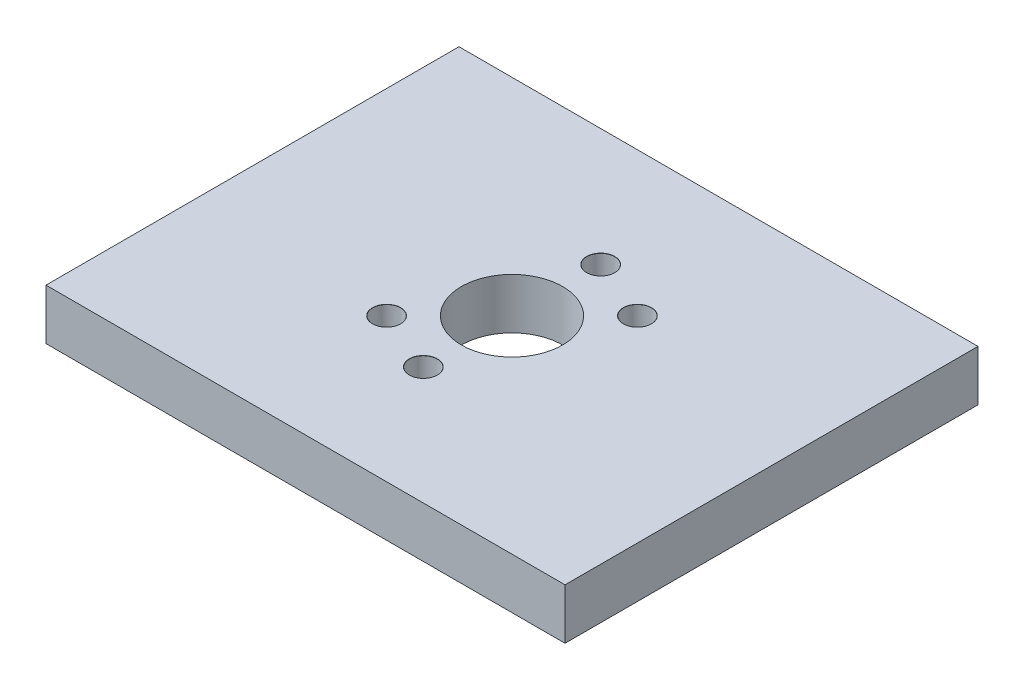
ISO-10303-21;
HEADER;
FILE_DESCRIPTION(('STEP AP214'),'2;1');
FILE_NAME('part.step','',(''),(''),'','','');
FILE_SCHEMA(('AUTOMOTIVE_DESIGN { 1 0 10303 214 1 1 1 1 }'));
ENDSEC;
DATA;
#1=APPLICATION_CONTEXT('core data for automotive mechanical design processes');
#2=APPLICATION_PROTOCOL_DEFINITION('international standard','automotive_design',2000,#1);
#3=PRODUCT_CONTEXT('',#1,'mechanical');
#4=PRODUCT('Part','Part','',(#3));
#5=PRODUCT_RELATED_PRODUCT_CATEGORY('part','',(#4));
#6=PRODUCT_DEFINITION_FORMATION('','',#4);
#7=PRODUCT_DEFINITION_CONTEXT('part definition',#1,'design');
#8=PRODUCT_DEFINITION('design','',#6,#7);
#9=PRODUCT_DEFINITION_SHAPE('','',#8);
#10=(LENGTH_UNIT() NAMED_UNIT(*) SI_UNIT(.MILLI.,.METRE.));
#11=(NAMED_UNIT(*) PLANE_ANGLE_UNIT() SI_UNIT($,.RADIAN.));
#12=(NAMED_UNIT(*) SI_UNIT($,.STERADIAN.) SOLID_ANGLE_UNIT());
#13=UNCERTAINTY_MEASURE_WITH_UNIT(LENGTH_MEASURE(1.E-05),#10,'distance_accuracy_value','');
#14=(GEOMETRIC_REPRESENTATION_CONTEXT(3) GLOBAL_UNCERTAINTY_ASSIGNED_CONTEXT((#13)) GLOBAL_UNIT_ASSIGNED_CONTEXT((#10,
#11,#12)) REPRESENTATION_CONTEXT('',''));
#15=CARTESIAN_POINT('',(0.,0.,0.));
#16=DIRECTION('',(0.,0.,1.));
#17=DIRECTION('',(1.,0.,0.));
#18=AXIS2_PLACEMENT_3D('',#15,#16,#17);
#19=CARTESIAN_POINT('',(51.2218795930272,10.,40.7541930276946));
#20=DIRECTION('',(-1.,0.,0.));
#21=DIRECTION('',(0.,0.,1.));
#22=AXIS2_PLACEMENT_3D('',#19,#20,#21);
#23=PLANE('',#22);
#24=DIRECTION('',(0.,0.,-1.));
#25=VECTOR('',#24,1.);
#26=CARTESIAN_POINT('',(51.2218795930272,0.,40.7541930276946));
#27=LINE('',#26,#25);
#28=CARTESIAN_POINT('',(51.2218795930272,0.,40.7541930276946));
#29=VERTEX_POINT('',#28);
#30=CARTESIAN_POINT('',(51.2218795930272,0.,-40.7541930276946));
#31=VERTEX_POINT('',#30);
#32=EDGE_CURVE('E99',#29,#31,#27,.T.);
#33=ORIENTED_EDGE('',*,*,#32,.T.);
#34=DIRECTION('',(0.,-1.,0.));
#35=VECTOR('',#34,1.);
#36=CARTESIAN_POINT('',(51.2218795930272,10.,-40.7541930276946));
#37=LINE('',#36,#35);
#38=CARTESIAN_POINT('',(51.2218795930272,10.,-40.7541930276946));
#39=VERTEX_POINT('',#38);
#40=EDGE_CURVE('E11',#39,#31,#37,.T.);
#41=ORIENTED_EDGE('',*,*,#40,.F.);
#42=DIRECTION('',(0.,0.,-1.));
#43=VECTOR('',#42,1.);
#44=CARTESIAN_POINT('',(51.2218795930272,10.,40.7541930276946));
#45=LINE('',#44,#43);
#46=CARTESIAN_POINT('',(51.2218795930272,10.,40.7541930276946));
#47=VERTEX_POINT('',#46);
#48=EDGE_CURVE('E87',#47,#39,#45,.T.);
#49=ORIENTED_EDGE('',*,*,#48,.F.);
#50=DIRECTION('',(0.,-1.,0.));
#51=VECTOR('',#50,1.);
#52=CARTESIAN_POINT('',(51.2218795930272,10.,40.7541930276946));
#53=LINE('',#52,#51);
#54=EDGE_CURVE('E95',#47,#29,#53,.T.);
#55=ORIENTED_EDGE('',*,*,#54,.T.);
#56=EDGE_LOOP('',(#33,#41,#49,#55));
#57=FACE_BOUND('',#56,.T.);
#58=ADVANCED_FACE('F36',(#57),#23,.F.);
#59=CARTESIAN_POINT('',(-51.2218795930272,10.,-40.7541930276946));
#60=DIRECTION('',(0.,0.,1.));
#61=DIRECTION('',(1.,0.,0.));
#62=AXIS2_PLACEMENT_3D('',#59,#60,#61);
#63=PLANE('',#62);
#64=DIRECTION('',(-1.,0.,0.));
#65=VECTOR('',#64,1.);
#66=CARTESIAN_POINT('',(-51.2218795930272,0.,-40.7541930276946));
#67=LINE('',#66,#65);
#68=CARTESIAN_POINT('',(-51.2218795930272,0.,-40.7541930276946));
#69=VERTEX_POINT('',#68);
#70=EDGE_CURVE('E91',#31,#69,#67,.T.);
#71=ORIENTED_EDGE('',*,*,#70,.T.);
#72=DIRECTION('',(0.,-1.,0.));
#73=VECTOR('',#72,1.);
#74=CARTESIAN_POINT('',(-51.2218795930272,10.,-40.7541930276946));
#75=LINE('',#74,#73);
#76=CARTESIAN_POINT('',(-51.2218795930272,10.,-40.7541930276946));
#77=VERTEX_POINT('',#76);
#78=EDGE_CURVE('E44',#77,#69,#75,.T.);
#79=ORIENTED_EDGE('',*,*,#78,.F.);
#80=DIRECTION('',(-1.,0.,0.));
#81=VECTOR('',#80,1.);
#82=CARTESIAN_POINT('',(-51.2218795930272,10.,-40.7541930276946));
#83=LINE('',#82,#81);
#84=EDGE_CURVE('E82',#39,#77,#83,.T.);
#85=ORIENTED_EDGE('',*,*,#84,.F.);
#86=ORIENTED_EDGE('',*,*,#40,.T.);
#87=EDGE_LOOP('',(#71,#79,#85,#86));
#88=FACE_BOUND('',#87,.T.);
#89=ADVANCED_FACE('F90',(#88),#63,.F.);
#90=CARTESIAN_POINT('',(-51.2218795930272,10.,40.7541930276946));
#91=DIRECTION('',(1.,0.,0.));
#92=DIRECTION('',(0.,0.,-1.));
#93=AXIS2_PLACEMENT_3D('',#90,#91,#92);
#94=PLANE('',#93);
#95=DIRECTION('',(0.,0.,1.));
#96=VECTOR('',#95,1.);
#97=CARTESIAN_POINT('',(-51.2218795930272,0.,40.7541930276946));
#98=LINE('',#97,#96);
#99=CARTESIAN_POINT('',(-51.2218795930272,0.,40.7541930276946));
#100=VERTEX_POINT('',#99);
#101=EDGE_CURVE('E69',#69,#100,#98,.T.);
#102=ORIENTED_EDGE('',*,*,#101,.T.);
#103=DIRECTION('',(0.,-1.,0.));
#104=VECTOR('',#103,1.);
#105=CARTESIAN_POINT('',(-51.2218795930272,10.,40.7541930276946));
#106=LINE('',#105,#104);
#107=CARTESIAN_POINT('',(-51.2218795930272,10.,40.7541930276946));
#108=VERTEX_POINT('',#107);
#109=EDGE_CURVE('E92',#108,#100,#106,.T.);
#110=ORIENTED_EDGE('',*,*,#109,.F.);
#111=DIRECTION('',(0.,0.,1.));
#112=VECTOR('',#111,1.);
#113=CARTESIAN_POINT('',(-51.2218795930272,10.,40.7541930276946));
#114=LINE('',#113,#112);
#115=EDGE_CURVE('E85',#77,#108,#114,.T.);
#116=ORIENTED_EDGE('',*,*,#115,.F.);
#117=ORIENTED_EDGE('',*,*,#78,.T.);
#118=EDGE_LOOP('',(#102,#110,#116,#117));
#119=FACE_BOUND('',#118,.T.);
#120=ADVANCED_FACE('F93',(#119),#94,.F.);
#121=CARTESIAN_POINT('',(-51.2218795930272,10.,40.7541930276946));
#122=DIRECTION('',(0.,0.,-1.));
#123=DIRECTION('',(-1.,0.,0.));
#124=AXIS2_PLACEMENT_3D('',#121,#122,#123);
#125=PLANE('',#124);
#126=DIRECTION('',(1.,0.,0.));
#127=VECTOR('',#126,1.);
#128=CARTESIAN_POINT('',(-51.2218795930272,0.,40.7541930276946));
#129=LINE('',#128,#127);
#130=EDGE_CURVE('E75',#100,#29,#129,.T.);
#131=ORIENTED_EDGE('',*,*,#130,.T.);
#132=ORIENTED_EDGE('',*,*,#54,.F.);
#133=DIRECTION('',(1.,0.,0.));
#134=VECTOR('',#133,1.);
#135=CARTESIAN_POINT('',(-51.2218795930272,10.,40.7541930276946));
#136=LINE('',#135,#134);
#137=EDGE_CURVE('E52',#108,#47,#136,.T.);
#138=ORIENTED_EDGE('',*,*,#137,.F.);
#139=ORIENTED_EDGE('',*,*,#109,.T.);
#140=EDGE_LOOP('',(#131,#132,#138,#139));
#141=FACE_BOUND('',#140,.T.);
#142=ADVANCED_FACE('F107',(#141),#125,.F.);
#143=CARTESIAN_POINT('',(0.,10.,0.));
#144=DIRECTION('',(0.,-1.,0.));
#145=DIRECTION('',(0.,0.,-1.));
#146=AXIS2_PLACEMENT_3D('',#143,#144,#145);
#147=PLANE('',#146);
#148=CARTESIAN_POINT('',(0.,10.,0.));
#149=DIRECTION('',(0.,1.,0.));
#150=DIRECTION('',(0.,0.,1.));
#151=AXIS2_PLACEMENT_3D('',#148,#149,#150);
#152=CIRCLE('',#151,10.);
#153=CARTESIAN_POINT('',(0.,10.,10.));
#154=VERTEX_POINT('',#153);
#155=EDGE_CURVE('E149',#154,#154,#152,.T.);
#156=ORIENTED_EDGE('',*,*,#155,.F.);
#157=EDGE_LOOP('',(#156));
#158=FACE_BOUND('',#157,.T.);
#159=CARTESIAN_POINT('',(-12.3743686707647,10.,12.3743686707645));
#160=DIRECTION('',(0.,1.,0.));
#161=DIRECTION('',(0.,0.,1.));
#162=AXIS2_PLACEMENT_3D('',#159,#160,#161);
#163=CIRCLE('',#162,2.775);
#164=CARTESIAN_POINT('',(-12.3743686707647,10.,15.1493686707645));
#165=VERTEX_POINT('',#164);
#166=EDGE_CURVE('E145',#165,#165,#163,.T.);
#167=ORIENTED_EDGE('',*,*,#166,.F.);
#168=EDGE_LOOP('',(#167));
#169=FACE_BOUND('',#168,.T.);
#170=CARTESIAN_POINT('',(-1.196959198424E-13,10.,17.5));
#171=DIRECTION('',(0.,1.,0.));
#172=DIRECTION('',(0.,0.,1.));
#173=AXIS2_PLACEMENT_3D('',#170,#171,#172);
#174=CIRCLE('',#173,2.775);
#175=CARTESIAN_POINT('',(-1.196959198424E-13,10.,20.275));
#176=VERTEX_POINT('',#175);
#177=EDGE_CURVE('E136',#176,#176,#174,.T.);
#178=ORIENTED_EDGE('',*,*,#177,.F.);
#179=EDGE_LOOP('',(#178));
#180=FACE_BOUND('',#179,.T.);
#181=CARTESIAN_POINT('',(12.3743686707648,10.,-12.3743686707644));
#182=DIRECTION('',(0.,1.,0.));
#183=DIRECTION('',(0.,0.,1.));
#184=AXIS2_PLACEMENT_3D('',#181,#182,#183);
#185=CIRCLE('',#184,2.775);
#186=CARTESIAN_POINT('',(12.3743686707648,10.,-9.59936867076439));
#187=VERTEX_POINT('',#186);
#188=EDGE_CURVE('E127',#187,#187,#185,.T.);
#189=ORIENTED_EDGE('',*,*,#188,.F.);
#190=EDGE_LOOP('',(#189));
#191=FACE_BOUND('',#190,.T.);
#192=CARTESIAN_POINT('',(0.,10.,-17.5));
#193=DIRECTION('',(0.,1.,0.));
#194=DIRECTION('',(0.,0.,1.));
#195=AXIS2_PLACEMENT_3D('',#192,#193,#194);
#196=CIRCLE('',#195,2.775);
#197=CARTESIAN_POINT('',(0.,10.,-14.725));
#198=VERTEX_POINT('',#197);
#199=EDGE_CURVE('E118',#198,#198,#196,.T.);
#200=ORIENTED_EDGE('',*,*,#199,.F.);
#201=EDGE_LOOP('',(#200));
#202=FACE_BOUND('',#201,.T.);
#203=ORIENTED_EDGE('',*,*,#48,.T.);
#204=ORIENTED_EDGE('',*,*,#84,.T.);
#205=ORIENTED_EDGE('',*,*,#115,.T.);
#206=ORIENTED_EDGE('',*,*,#137,.T.);
#207=EDGE_LOOP('',(#203,#204,#205,#206));
#208=FACE_BOUND('',#207,.T.);
#209=ADVANCED_FACE('F83',(#158,#169,#180,#191,#202,#208),#147,.F.);
#210=CARTESIAN_POINT('',(0.,0.,0.));
#211=DIRECTION('',(0.,-1.,0.));
#212=DIRECTION('',(0.,0.,-1.));
#213=AXIS2_PLACEMENT_3D('',#210,#211,#212);
#214=PLANE('',#213);
#215=CARTESIAN_POINT('',(0.,0.,0.));
#216=DIRECTION('',(0.,1.,0.));
#217=DIRECTION('',(0.,0.,1.));
#218=AXIS2_PLACEMENT_3D('',#215,#216,#217);
#219=CIRCLE('',#218,10.);
#220=CARTESIAN_POINT('',(0.,0.,10.));
#221=VERTEX_POINT('',#220);
#222=EDGE_CURVE('E148',#221,#221,#219,.T.);
#223=ORIENTED_EDGE('',*,*,#222,.T.);
#224=EDGE_LOOP('',(#223));
#225=FACE_BOUND('',#224,.T.);
#226=CARTESIAN_POINT('',(-12.3743686707647,0.,12.3743686707645));
#227=DIRECTION('',(0.,1.,0.));
#228=DIRECTION('',(0.,0.,1.));
#229=AXIS2_PLACEMENT_3D('',#226,#227,#228);
#230=CIRCLE('',#229,2.75);
#231=CARTESIAN_POINT('',(-12.3743686707647,0.,15.1243686707645));
#232=VERTEX_POINT('',#231);
#233=EDGE_CURVE('E139',#232,#232,#230,.T.);
#234=ORIENTED_EDGE('',*,*,#233,.T.);
#235=EDGE_LOOP('',(#234));
#236=FACE_BOUND('',#235,.T.);
#237=CARTESIAN_POINT('',(-1.196959198424E-13,0.,17.5));
#238=DIRECTION('',(0.,1.,0.));
#239=DIRECTION('',(0.,0.,1.));
#240=AXIS2_PLACEMENT_3D('',#237,#238,#239);
#241=CIRCLE('',#240,2.75);
#242=CARTESIAN_POINT('',(-1.196959198424E-13,0.,20.25));
#243=VERTEX_POINT('',#242);
#244=EDGE_CURVE('E130',#243,#243,#241,.T.);
#245=ORIENTED_EDGE('',*,*,#244,.T.);
#246=EDGE_LOOP('',(#245));
#247=FACE_BOUND('',#246,.T.);
#248=CARTESIAN_POINT('',(12.3743686707648,0.,-12.3743686707644));
#249=DIRECTION('',(0.,1.,0.));
#250=DIRECTION('',(0.,0.,1.));
#251=AXIS2_PLACEMENT_3D('',#248,#249,#250);
#252=CIRCLE('',#251,2.75);
#253=CARTESIAN_POINT('',(12.3743686707648,0.,-9.6243686707644));
#254=VERTEX_POINT('',#253);
#255=EDGE_CURVE('E121',#254,#254,#252,.T.);
#256=ORIENTED_EDGE('',*,*,#255,.T.);
#257=EDGE_LOOP('',(#256));
#258=FACE_BOUND('',#257,.T.);
#259=CARTESIAN_POINT('',(0.,0.,-17.5));
#260=DIRECTION('',(0.,1.,0.));
#261=DIRECTION('',(0.,0.,1.));
#262=AXIS2_PLACEMENT_3D('',#259,#260,#261);
#263=CIRCLE('',#262,2.75);
#264=CARTESIAN_POINT('',(0.,0.,-14.75));
#265=VERTEX_POINT('',#264);
#266=EDGE_CURVE('E102',#265,#265,#263,.T.);
#267=ORIENTED_EDGE('',*,*,#266,.T.);
#268=EDGE_LOOP('',(#267));
#269=FACE_BOUND('',#268,.T.);
#270=ORIENTED_EDGE('',*,*,#32,.F.);
#271=ORIENTED_EDGE('',*,*,#130,.F.);
#272=ORIENTED_EDGE('',*,*,#101,.F.);
#273=ORIENTED_EDGE('',*,*,#70,.F.);
#274=EDGE_LOOP('',(#270,#271,#272,#273));
#275=FACE_BOUND('',#274,.T.);
#276=ADVANCED_FACE('F110',(#225,#236,#247,#258,#269,#275),#214,.T.);
#277=CARTESIAN_POINT('',(0.,10.,-17.5));
#278=DIRECTION('',(0.,1.,0.));
#279=DIRECTION('',(0.,0.,1.));
#280=AXIS2_PLACEMENT_3D('',#277,#278,#279);
#281=CYLINDRICAL_SURFACE('',#280,2.75);
#282=ORIENTED_EDGE('',*,*,#266,.F.);
#283=EDGE_LOOP('',(#282));
#284=FACE_BOUND('',#283,.T.);
#285=CARTESIAN_POINT('',(0.,9.975,-17.5));
#286=DIRECTION('',(0.,1.,0.));
#287=DIRECTION('',(0.,0.,1.));
#288=AXIS2_PLACEMENT_3D('',#285,#286,#287);
#289=CIRCLE('',#288,2.75);
#290=CARTESIAN_POINT('',(0.,9.975,-14.75));
#291=VERTEX_POINT('',#290);
#292=EDGE_CURVE('E115',#291,#291,#289,.T.);
#293=ORIENTED_EDGE('',*,*,#292,.T.);
#294=EDGE_LOOP('',(#293));
#295=FACE_BOUND('',#294,.T.);
#296=ADVANCED_FACE('F178',(#284,#295),#281,.F.);
#297=CARTESIAN_POINT('',(0.,10.,-17.5));
#298=DIRECTION('',(0.,1.,0.));
#299=DIRECTION('',(0.,0.,1.));
#300=AXIS2_PLACEMENT_3D('',#297,#298,#299);
#301=CONICAL_SURFACE('',#300,2.775,0.785398163397414);
#302=ORIENTED_EDGE('',*,*,#292,.F.);
#303=EDGE_LOOP('',(#302));
#304=FACE_BOUND('',#303,.T.);
#305=ORIENTED_EDGE('',*,*,#199,.T.);
#306=EDGE_LOOP('',(#305));
#307=FACE_BOUND('',#306,.T.);
#308=ADVANCED_FACE('F175',(#304,#307),#301,.F.);
#309=CARTESIAN_POINT('',(12.3743686707648,10.,-12.3743686707644));
#310=DIRECTION('',(0.,1.,0.));
#311=DIRECTION('',(0.,0.,1.));
#312=AXIS2_PLACEMENT_3D('',#309,#310,#311);
#313=CYLINDRICAL_SURFACE('',#312,2.75);
#314=ORIENTED_EDGE('',*,*,#255,.F.);
#315=EDGE_LOOP('',(#314));
#316=FACE_BOUND('',#315,.T.);
#317=CARTESIAN_POINT('',(12.3743686707648,9.975,-12.3743686707644));
#318=DIRECTION('',(0.,1.,0.));
#319=DIRECTION('',(0.,0.,1.));
#320=AXIS2_PLACEMENT_3D('',#317,#318,#319);
#321=CIRCLE('',#320,2.75);
#322=CARTESIAN_POINT('',(12.3743686707648,9.975,-9.62436867076439));
#323=VERTEX_POINT('',#322);
#324=EDGE_CURVE('E124',#323,#323,#321,.T.);
#325=ORIENTED_EDGE('',*,*,#324,.T.);
#326=EDGE_LOOP('',(#325));
#327=FACE_BOUND('',#326,.T.);
#328=ADVANCED_FACE('F177',(#316,#327),#313,.F.);
#329=CARTESIAN_POINT('',(12.3743686707648,10.,-12.3743686707644));
#330=DIRECTION('',(0.,1.,0.));
#331=DIRECTION('',(0.,0.,1.));
#332=AXIS2_PLACEMENT_3D('',#329,#330,#331);
#333=CONICAL_SURFACE('',#332,2.775,0.785398163397414);
#334=ORIENTED_EDGE('',*,*,#324,.F.);
#335=EDGE_LOOP('',(#334));
#336=FACE_BOUND('',#335,.T.);
#337=ORIENTED_EDGE('',*,*,#188,.T.);
#338=EDGE_LOOP('',(#337));
#339=FACE_BOUND('',#338,.T.);
#340=ADVANCED_FACE('F185',(#336,#339),#333,.F.);
#341=CARTESIAN_POINT('',(-1.196959198424E-13,10.,17.5));
#342=DIRECTION('',(0.,1.,0.));
#343=DIRECTION('',(0.,0.,1.));
#344=AXIS2_PLACEMENT_3D('',#341,#342,#343);
#345=CYLINDRICAL_SURFACE('',#344,2.75);
#346=ORIENTED_EDGE('',*,*,#244,.F.);
#347=EDGE_LOOP('',(#346));
#348=FACE_BOUND('',#347,.T.);
#349=CARTESIAN_POINT('',(-1.196959198424E-13,9.975,17.5));
#350=DIRECTION('',(0.,1.,0.));
#351=DIRECTION('',(0.,0.,1.));
#352=AXIS2_PLACEMENT_3D('',#349,#350,#351);
#353=CIRCLE('',#352,2.75);
#354=CARTESIAN_POINT('',(-1.196959198424E-13,9.975,20.25));
#355=VERTEX_POINT('',#354);
#356=EDGE_CURVE('E133',#355,#355,#353,.T.);
#357=ORIENTED_EDGE('',*,*,#356,.T.);
#358=EDGE_LOOP('',(#357));
#359=FACE_BOUND('',#358,.T.);
#360=ADVANCED_FACE('F235',(#348,#359),#345,.F.);
#361=CARTESIAN_POINT('',(-1.196959198424E-13,10.,17.5));
#362=DIRECTION('',(0.,1.,0.));
#363=DIRECTION('',(0.,0.,1.));
#364=AXIS2_PLACEMENT_3D('',#361,#362,#363);
#365=CONICAL_SURFACE('',#364,2.775,0.785398163397414);
#366=ORIENTED_EDGE('',*,*,#356,.F.);
#367=EDGE_LOOP('',(#366));
#368=FACE_BOUND('',#367,.T.);
#369=ORIENTED_EDGE('',*,*,#177,.T.);
#370=EDGE_LOOP('',(#369));
#371=FACE_BOUND('',#370,.T.);
#372=ADVANCED_FACE('F245',(#368,#371),#365,.F.);
#373=CARTESIAN_POINT('',(-12.3743686707647,10.,12.3743686707645));
#374=DIRECTION('',(0.,1.,0.));
#375=DIRECTION('',(0.,0.,1.));
#376=AXIS2_PLACEMENT_3D('',#373,#374,#375);
#377=CYLINDRICAL_SURFACE('',#376,2.75);
#378=ORIENTED_EDGE('',*,*,#233,.F.);
#379=EDGE_LOOP('',(#378));
#380=FACE_BOUND('',#379,.T.);
#381=CARTESIAN_POINT('',(-12.3743686707647,9.975,12.3743686707645));
#382=DIRECTION('',(0.,1.,0.));
#383=DIRECTION('',(0.,0.,1.));
#384=AXIS2_PLACEMENT_3D('',#381,#382,#383);
#385=CIRCLE('',#384,2.75);
#386=CARTESIAN_POINT('',(-12.3743686707647,9.975,15.1243686707645));
#387=VERTEX_POINT('',#386);
#388=EDGE_CURVE('E142',#387,#387,#385,.T.);
#389=ORIENTED_EDGE('',*,*,#388,.T.);
#390=EDGE_LOOP('',(#389));
#391=FACE_BOUND('',#390,.T.);
#392=ADVANCED_FACE('F255',(#380,#391),#377,.F.);
#393=CARTESIAN_POINT('',(-12.3743686707647,10.,12.3743686707645));
#394=DIRECTION('',(0.,1.,0.));
#395=DIRECTION('',(0.,0.,1.));
#396=AXIS2_PLACEMENT_3D('',#393,#394,#395);
#397=CONICAL_SURFACE('',#396,2.775,0.785398163397414);
#398=ORIENTED_EDGE('',*,*,#388,.F.);
#399=EDGE_LOOP('',(#398));
#400=FACE_BOUND('',#399,.T.);
#401=ORIENTED_EDGE('',*,*,#166,.T.);
#402=EDGE_LOOP('',(#401));
#403=FACE_BOUND('',#402,.T.);
#404=ADVANCED_FACE('F160',(#400,#403),#397,.F.);
#405=CARTESIAN_POINT('',(0.,0.,0.));
#406=DIRECTION('',(0.,1.,0.));
#407=DIRECTION('',(0.,0.,1.));
#408=AXIS2_PLACEMENT_3D('',#405,#406,#407);
#409=CYLINDRICAL_SURFACE('',#408,10.);
#410=ORIENTED_EDGE('',*,*,#222,.F.);
#411=EDGE_LOOP('',(#410));
#412=FACE_BOUND('',#411,.T.);
#413=ORIENTED_EDGE('',*,*,#155,.T.);
#414=EDGE_LOOP('',(#413));
#415=FACE_BOUND('',#414,.T.);
#416=ADVANCED_FACE('F157',(#412,#415),#409,.F.);
#417=CLOSED_SHELL('',(#58,#89,#120,#142,#209,#276,#296,#308,#328,#340,#360,#372,#392,#404,#416));
#418=MANIFOLD_SOLID_BREP('B2',#417);
#419=ADVANCED_BREP_SHAPE_REPRESENTATION('',(#18,#418),#14);
#420=SHAPE_DEFINITION_REPRESENTATION(#9,#419);
ENDSEC;
END-ISO-10303-21;
